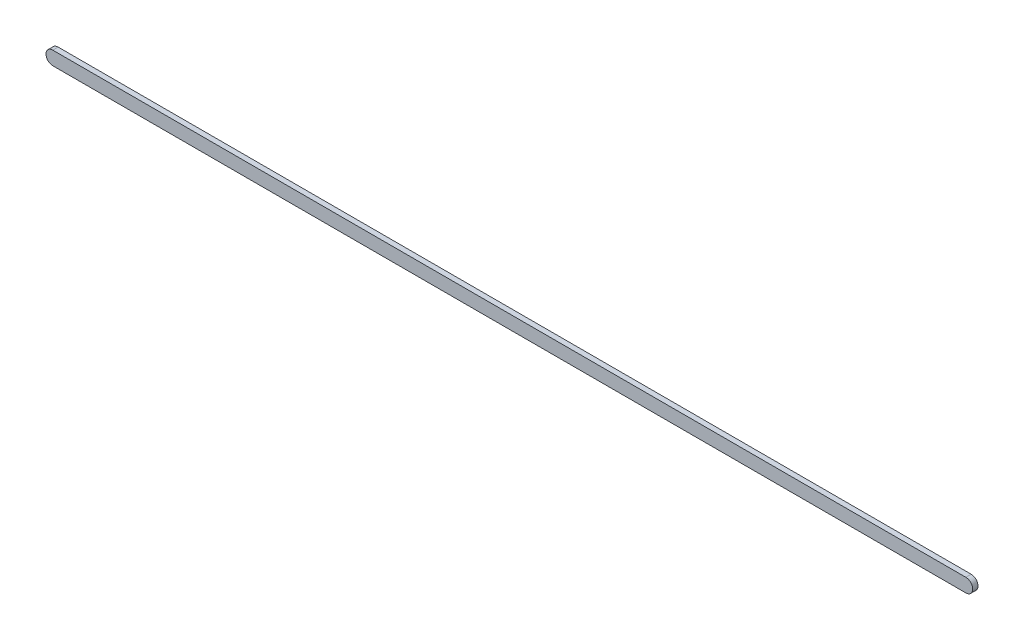
ISO-10303-21;
HEADER;
FILE_DESCRIPTION(('STEP AP214'),'2;1');
FILE_NAME('part.step','',(''),(''),'','','');
FILE_SCHEMA(('AUTOMOTIVE_DESIGN { 1 0 10303 214 1 1 1 1 }'));
ENDSEC;
DATA;
#1=APPLICATION_CONTEXT('core data for automotive mechanical design processes');
#2=APPLICATION_PROTOCOL_DEFINITION('international standard','automotive_design',2000,#1);
#3=PRODUCT_CONTEXT('',#1,'mechanical');
#4=PRODUCT('Part','Part','',(#3));
#5=PRODUCT_RELATED_PRODUCT_CATEGORY('part','',(#4));
#6=PRODUCT_DEFINITION_FORMATION('','',#4);
#7=PRODUCT_DEFINITION_CONTEXT('part definition',#1,'design');
#8=PRODUCT_DEFINITION('design','',#6,#7);
#9=PRODUCT_DEFINITION_SHAPE('','',#8);
#10=(LENGTH_UNIT() NAMED_UNIT(*) SI_UNIT(.MILLI.,.METRE.));
#11=(NAMED_UNIT(*) PLANE_ANGLE_UNIT() SI_UNIT($,.RADIAN.));
#12=(NAMED_UNIT(*) SI_UNIT($,.STERADIAN.) SOLID_ANGLE_UNIT());
#13=UNCERTAINTY_MEASURE_WITH_UNIT(LENGTH_MEASURE(1.E-05),#10,'distance_accuracy_value','');
#14=(GEOMETRIC_REPRESENTATION_CONTEXT(3) GLOBAL_UNCERTAINTY_ASSIGNED_CONTEXT((#13)) GLOBAL_UNIT_ASSIGNED_CONTEXT((#10,
#11,#12)) REPRESENTATION_CONTEXT('',''));
#15=CARTESIAN_POINT('',(0.,0.,0.));
#16=DIRECTION('',(0.,0.,1.));
#17=DIRECTION('',(1.,0.,0.));
#18=AXIS2_PLACEMENT_3D('',#15,#16,#17);
#19=CARTESIAN_POINT('',(116.4336,52.8066,0.));
#20=DIRECTION('',(0.,1.,0.));
#21=DIRECTION('',(1.,0.,0.));
#22=AXIS2_PLACEMENT_3D('',#19,#20,#21);
#23=PLANE('',#22);
#24=DIRECTION('',(1.,0.,0.));
#25=VECTOR('',#24,1.);
#26=CARTESIAN_POINT('',(116.4336,52.8066,0.1999996));
#27=LINE('',#26,#25);
#28=CARTESIAN_POINT('',(116.4336,52.8066,0.1999996));
#29=VERTEX_POINT('',#28);
#30=CARTESIAN_POINT('',(150.6870748,52.8066,0.1999996));
#31=VERTEX_POINT('',#30);
#32=EDGE_CURVE('E11',#29,#31,#27,.T.);
#33=ORIENTED_EDGE('',*,*,#32,.F.);
#34=DIRECTION('',(0.,0.,1.));
#35=VECTOR('',#34,1.);
#36=CARTESIAN_POINT('',(116.4336,52.8066,0.));
#37=LINE('',#36,#35);
#38=CARTESIAN_POINT('',(116.4336,52.8066,0.));
#39=VERTEX_POINT('',#38);
#40=EDGE_CURVE('E24',#39,#29,#37,.T.);
#41=ORIENTED_EDGE('',*,*,#40,.F.);
#42=DIRECTION('',(1.,0.,0.));
#43=VECTOR('',#42,1.);
#44=CARTESIAN_POINT('',(116.4336,52.8066,0.));
#45=LINE('',#44,#43);
#46=CARTESIAN_POINT('',(150.6870748,52.8066,0.));
#47=VERTEX_POINT('',#46);
#48=EDGE_CURVE('E75',#39,#47,#45,.T.);
#49=ORIENTED_EDGE('',*,*,#48,.T.);
#50=DIRECTION('',(0.,0.,1.));
#51=VECTOR('',#50,1.);
#52=CARTESIAN_POINT('',(150.6870748,52.8066,0.));
#53=LINE('',#52,#51);
#54=EDGE_CURVE('E37',#47,#31,#53,.T.);
#55=ORIENTED_EDGE('',*,*,#54,.T.);
#56=EDGE_LOOP('',(#33,#41,#49,#55));
#57=FACE_BOUND('',#56,.T.);
#58=ADVANCED_FACE('F17',(#57),#23,.F.);
#59=CARTESIAN_POINT('',(150.6870748,53.0606,0.));
#60=DIRECTION('',(0.,0.,-1.));
#61=DIRECTION('',(-1.11896493820492E-13,-1.,0.));
#62=AXIS2_PLACEMENT_3D('',#59,#60,#61);
#63=CYLINDRICAL_SURFACE('',#62,0.253999999999995);
#64=CARTESIAN_POINT('',(150.6870748,53.0606,0.1999996));
#65=DIRECTION('',(0.,0.,1.));
#66=DIRECTION('',(-1.11896493820492E-13,-1.,0.));
#67=AXIS2_PLACEMENT_3D('',#64,#65,#66);
#68=CIRCLE('',#67,0.253999999999995);
#69=CARTESIAN_POINT('',(150.6870748,53.3146,0.1999996));
#70=VERTEX_POINT('',#69);
#71=EDGE_CURVE('E83',#31,#70,#68,.T.);
#72=ORIENTED_EDGE('',*,*,#71,.F.);
#73=ORIENTED_EDGE('',*,*,#54,.F.);
#74=CARTESIAN_POINT('',(150.6870748,53.0606,0.));
#75=DIRECTION('',(0.,0.,1.));
#76=DIRECTION('',(-1.11896493820492E-13,-1.,0.));
#77=AXIS2_PLACEMENT_3D('',#74,#75,#76);
#78=CIRCLE('',#77,0.253999999999995);
#79=CARTESIAN_POINT('',(150.6870748,53.3146,0.));
#80=VERTEX_POINT('',#79);
#81=EDGE_CURVE('E81',#47,#80,#78,.T.);
#82=ORIENTED_EDGE('',*,*,#81,.T.);
#83=DIRECTION('',(0.,0.,1.));
#84=VECTOR('',#83,1.);
#85=CARTESIAN_POINT('',(150.6870748,53.3146,0.));
#86=LINE('',#85,#84);
#87=EDGE_CURVE('E67',#80,#70,#86,.T.);
#88=ORIENTED_EDGE('',*,*,#87,.T.);
#89=EDGE_LOOP('',(#72,#73,#82,#88));
#90=FACE_BOUND('',#89,.T.);
#91=ADVANCED_FACE('F89',(#90),#63,.T.);
#92=CARTESIAN_POINT('',(150.6870748,53.3146,0.));
#93=DIRECTION('',(0.,-1.,0.));
#94=DIRECTION('',(-1.,0.,0.));
#95=AXIS2_PLACEMENT_3D('',#92,#93,#94);
#96=PLANE('',#95);
#97=DIRECTION('',(-1.,0.,0.));
#98=VECTOR('',#97,1.);
#99=CARTESIAN_POINT('',(150.6870748,53.3146,0.1999996));
#100=LINE('',#99,#98);
#101=CARTESIAN_POINT('',(116.4336,53.3146,0.1999996));
#102=VERTEX_POINT('',#101);
#103=EDGE_CURVE('E71',#70,#102,#100,.T.);
#104=ORIENTED_EDGE('',*,*,#103,.F.);
#105=ORIENTED_EDGE('',*,*,#87,.F.);
#106=DIRECTION('',(-1.,0.,0.));
#107=VECTOR('',#106,1.);
#108=CARTESIAN_POINT('',(150.6870748,53.3146,0.));
#109=LINE('',#108,#107);
#110=CARTESIAN_POINT('',(116.4336,53.3146,0.));
#111=VERTEX_POINT('',#110);
#112=EDGE_CURVE('E63',#80,#111,#109,.T.);
#113=ORIENTED_EDGE('',*,*,#112,.T.);
#114=DIRECTION('',(0.,0.,1.));
#115=VECTOR('',#114,1.);
#116=CARTESIAN_POINT('',(116.4336,53.3146,0.));
#117=LINE('',#116,#115);
#118=EDGE_CURVE('E53',#111,#102,#117,.T.);
#119=ORIENTED_EDGE('',*,*,#118,.T.);
#120=EDGE_LOOP('',(#104,#105,#113,#119));
#121=FACE_BOUND('',#120,.T.);
#122=ADVANCED_FACE('F66',(#121),#96,.F.);
#123=CARTESIAN_POINT('',(116.4336,53.0606,0.));
#124=DIRECTION('',(0.,0.,-1.));
#125=DIRECTION('',(0.,1.,0.));
#126=AXIS2_PLACEMENT_3D('',#123,#124,#125);
#127=CYLINDRICAL_SURFACE('',#126,0.254);
#128=CARTESIAN_POINT('',(116.4336,53.0606,0.1999996));
#129=DIRECTION('',(0.,0.,1.));
#130=DIRECTION('',(0.,1.,0.));
#131=AXIS2_PLACEMENT_3D('',#128,#129,#130);
#132=CIRCLE('',#131,0.254);
#133=EDGE_CURVE('E59',#102,#29,#132,.T.);
#134=ORIENTED_EDGE('',*,*,#133,.F.);
#135=ORIENTED_EDGE('',*,*,#118,.F.);
#136=CARTESIAN_POINT('',(116.4336,53.0606,0.));
#137=DIRECTION('',(0.,0.,1.));
#138=DIRECTION('',(0.,1.,0.));
#139=AXIS2_PLACEMENT_3D('',#136,#137,#138);
#140=CIRCLE('',#139,0.254);
#141=EDGE_CURVE('E57',#111,#39,#140,.T.);
#142=ORIENTED_EDGE('',*,*,#141,.T.);
#143=ORIENTED_EDGE('',*,*,#40,.T.);
#144=EDGE_LOOP('',(#134,#135,#142,#143));
#145=FACE_BOUND('',#144,.T.);
#146=ADVANCED_FACE('F55',(#145),#127,.T.);
#147=CARTESIAN_POINT('',(116.4336,52.8066,0.));
#148=DIRECTION('',(0.,0.,-1.));
#149=DIRECTION('',(-1.,0.,0.));
#150=AXIS2_PLACEMENT_3D('',#147,#148,#149);
#151=PLANE('',#150);
#152=ORIENTED_EDGE('',*,*,#141,.F.);
#153=ORIENTED_EDGE('',*,*,#112,.F.);
#154=ORIENTED_EDGE('',*,*,#81,.F.);
#155=ORIENTED_EDGE('',*,*,#48,.F.);
#156=EDGE_LOOP('',(#152,#153,#154,#155));
#157=FACE_BOUND('',#156,.T.);
#158=ADVANCED_FACE('F74',(#157),#151,.T.);
#159=CARTESIAN_POINT('',(116.4336,52.8066,0.1999996));
#160=DIRECTION('',(0.,0.,-1.));
#161=DIRECTION('',(-1.,0.,0.));
#162=AXIS2_PLACEMENT_3D('',#159,#160,#161);
#163=PLANE('',#162);
#164=ORIENTED_EDGE('',*,*,#32,.T.);
#165=ORIENTED_EDGE('',*,*,#71,.T.);
#166=ORIENTED_EDGE('',*,*,#103,.T.);
#167=ORIENTED_EDGE('',*,*,#133,.T.);
#168=EDGE_LOOP('',(#164,#165,#166,#167));
#169=FACE_BOUND('',#168,.T.);
#170=ADVANCED_FACE('F91',(#169),#163,.F.);
#171=CLOSED_SHELL('',(#58,#91,#122,#146,#158,#170));
#172=MANIFOLD_SOLID_BREP('B1',#171);
#173=ADVANCED_BREP_SHAPE_REPRESENTATION('',(#18,#172),#14);
#174=SHAPE_DEFINITION_REPRESENTATION(#9,#173);
ENDSEC;
END-ISO-10303-21;
